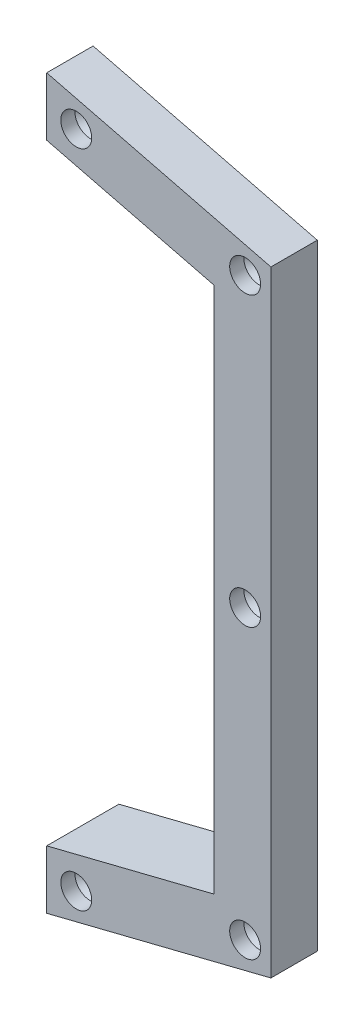
ISO-10303-21;
HEADER;
FILE_DESCRIPTION(('STEP AP214'),'2;1');
FILE_NAME('part.step','',(''),(''),'','','');
FILE_SCHEMA(('AUTOMOTIVE_DESIGN { 1 0 10303 214 1 1 1 1 }'));
ENDSEC;
DATA;
#1=APPLICATION_CONTEXT('core data for automotive mechanical design processes');
#2=APPLICATION_PROTOCOL_DEFINITION('international standard','automotive_design',2000,#1);
#3=PRODUCT_CONTEXT('',#1,'mechanical');
#4=PRODUCT('Part','Part','',(#3));
#5=PRODUCT_RELATED_PRODUCT_CATEGORY('part','',(#4));
#6=PRODUCT_DEFINITION_FORMATION('','',#4);
#7=PRODUCT_DEFINITION_CONTEXT('part definition',#1,'design');
#8=PRODUCT_DEFINITION('design','',#6,#7);
#9=PRODUCT_DEFINITION_SHAPE('','',#8);
#10=(LENGTH_UNIT() NAMED_UNIT(*) SI_UNIT(.MILLI.,.METRE.));
#11=(NAMED_UNIT(*) PLANE_ANGLE_UNIT() SI_UNIT($,.RADIAN.));
#12=(NAMED_UNIT(*) SI_UNIT($,.STERADIAN.) SOLID_ANGLE_UNIT());
#13=UNCERTAINTY_MEASURE_WITH_UNIT(LENGTH_MEASURE(1.E-05),#10,'distance_accuracy_value','');
#14=(GEOMETRIC_REPRESENTATION_CONTEXT(3) GLOBAL_UNCERTAINTY_ASSIGNED_CONTEXT((#13)) GLOBAL_UNIT_ASSIGNED_CONTEXT((#10,
#11,#12)) REPRESENTATION_CONTEXT('',''));
#15=CARTESIAN_POINT('',(0.,0.,0.));
#16=DIRECTION('',(0.,0.,1.));
#17=DIRECTION('',(1.,0.,0.));
#18=AXIS2_PLACEMENT_3D('',#15,#16,#17);
#19=CARTESIAN_POINT('',(35.8540171919359,215.661961497236,752.225073242188));
#20=DIRECTION('',(0.,0.,1.));
#21=DIRECTION('',(1.,0.,0.));
#22=AXIS2_PLACEMENT_3D('',#19,#20,#21);
#23=CONICAL_SURFACE('',#22,2.375,0.785398163397448);
#24=CARTESIAN_POINT('',(35.8540171919359,215.661961497236,751.600073242188));
#25=DIRECTION('',(0.,0.,-1.));
#26=DIRECTION('',(1.,0.,0.));
#27=AXIS2_PLACEMENT_3D('',#24,#25,#26);
#28=CIRCLE('',#27,1.75);
#29=CARTESIAN_POINT('',(37.6040171919359,215.661961497236,751.600073242188));
#30=VERTEX_POINT('',#29);
#31=EDGE_CURVE('E10',#30,#30,#28,.T.);
#32=ORIENTED_EDGE('',*,*,#31,.T.);
#33=EDGE_LOOP('',(#32));
#34=FACE_BOUND('',#33,.T.);
#35=CARTESIAN_POINT('',(35.8540171919359,215.661961497236,752.850073242188));
#36=DIRECTION('',(0.,0.,1.));
#37=DIRECTION('',(1.,0.,0.));
#38=AXIS2_PLACEMENT_3D('',#35,#36,#37);
#39=CIRCLE('',#38,3.);
#40=CARTESIAN_POINT('',(38.8540171919359,215.661961497236,752.850073242188));
#41=VERTEX_POINT('',#40);
#42=EDGE_CURVE('E25',#41,#41,#39,.T.);
#43=ORIENTED_EDGE('',*,*,#42,.T.);
#44=EDGE_LOOP('',(#43));
#45=FACE_BOUND('',#44,.T.);
#46=ADVANCED_FACE('F15',(#34,#45),#23,.F.);
#47=CARTESIAN_POINT('',(35.8540171919359,215.661961497236,751.600073242188));
#48=DIRECTION('',(0.,0.,-1.));
#49=DIRECTION('',(-1.,0.,0.));
#50=AXIS2_PLACEMENT_3D('',#47,#48,#49);
#51=PLANE('',#50);
#52=CARTESIAN_POINT('',(35.8540171919359,215.661961497236,751.600073242188));
#53=DIRECTION('',(0.,0.,-1.));
#54=DIRECTION('',(1.,0.,0.));
#55=AXIS2_PLACEMENT_3D('',#52,#53,#54);
#56=CIRCLE('',#55,1.725);
#57=CARTESIAN_POINT('',(37.5790171919359,215.661961497236,751.600073242188));
#58=VERTEX_POINT('',#57);
#59=EDGE_CURVE('E293',#58,#58,#56,.T.);
#60=ORIENTED_EDGE('',*,*,#59,.T.);
#61=EDGE_LOOP('',(#60));
#62=FACE_BOUND('',#61,.T.);
#63=ORIENTED_EDGE('',*,*,#31,.F.);
#64=EDGE_LOOP('',(#63));
#65=FACE_BOUND('',#64,.T.);
#66=ADVANCED_FACE('F309',(#62,#65),#51,.F.);
#67=CARTESIAN_POINT('',(35.8540171919359,215.661961497236,765.599960327148));
#68=DIRECTION('',(0.,0.,1.));
#69=DIRECTION('',(1.,0.,0.));
#70=AXIS2_PLACEMENT_3D('',#67,#68,#69);
#71=CYLINDRICAL_SURFACE('',#70,3.);
#72=CARTESIAN_POINT('',(35.8540171919359,215.661961497236,755.600103759766));
#73=DIRECTION('',(0.,0.,-1.));
#74=DIRECTION('',(1.,0.,0.));
#75=AXIS2_PLACEMENT_3D('',#72,#73,#74);
#76=CIRCLE('',#75,3.);
#77=CARTESIAN_POINT('',(38.8540171919359,215.661961497236,755.600103759766));
#78=VERTEX_POINT('',#77);
#79=EDGE_CURVE('E193',#78,#78,#76,.T.);
#80=ORIENTED_EDGE('',*,*,#79,.F.);
#81=EDGE_LOOP('',(#80));
#82=FACE_BOUND('',#81,.T.);
#83=ORIENTED_EDGE('',*,*,#42,.F.);
#84=EDGE_LOOP('',(#83));
#85=FACE_BOUND('',#84,.T.);
#86=ADVANCED_FACE('F306',(#82,#85),#71,.F.);
#87=CARTESIAN_POINT('',(35.8540171919359,215.661961497236,749.599960327148));
#88=DIRECTION('',(0.,0.,-1.));
#89=DIRECTION('',(1.,0.,0.));
#90=AXIS2_PLACEMENT_3D('',#87,#88,#89);
#91=CYLINDRICAL_SURFACE('',#90,1.725);
#92=CARTESIAN_POINT('',(35.8540171919359,215.661961497236,746.599960327148));
#93=DIRECTION('',(0.,0.,1.));
#94=DIRECTION('',(1.,0.,0.));
#95=AXIS2_PLACEMENT_3D('',#92,#93,#94);
#96=CIRCLE('',#95,1.725);
#97=CARTESIAN_POINT('',(37.5790171919359,215.661961497236,746.599960327148));
#98=VERTEX_POINT('',#97);
#99=EDGE_CURVE('E159',#98,#98,#96,.T.);
#100=ORIENTED_EDGE('',*,*,#99,.F.);
#101=EDGE_LOOP('',(#100));
#102=FACE_BOUND('',#101,.T.);
#103=ORIENTED_EDGE('',*,*,#59,.F.);
#104=EDGE_LOOP('',(#103));
#105=FACE_BOUND('',#104,.T.);
#106=ADVANCED_FACE('F308',(#102,#105),#91,.F.);
#107=CARTESIAN_POINT('',(68.6260171919359,223.854961497236,753.100036621094));
#108=DIRECTION('',(0.,0.,1.));
#109=DIRECTION('',(1.,0.,0.));
#110=AXIS2_PLACEMENT_3D('',#107,#108,#109);
#111=CYLINDRICAL_SURFACE('',#110,3.);
#112=CARTESIAN_POINT('',(68.6260171919359,223.854961497236,755.600103759766));
#113=DIRECTION('',(0.,0.,-1.));
#114=DIRECTION('',(1.,0.,0.));
#115=AXIS2_PLACEMENT_3D('',#112,#113,#114);
#116=CIRCLE('',#115,3.);
#117=CARTESIAN_POINT('',(71.6260171919359,223.854961497236,755.600103759766));
#118=VERTEX_POINT('',#117);
#119=EDGE_CURVE('E189',#118,#118,#116,.T.);
#120=ORIENTED_EDGE('',*,*,#119,.F.);
#121=EDGE_LOOP('',(#120));
#122=FACE_BOUND('',#121,.T.);
#123=CARTESIAN_POINT('',(68.6260171919359,223.854961497236,752.850036621094));
#124=DIRECTION('',(0.,0.,1.));
#125=DIRECTION('',(-1.,0.,0.));
#126=AXIS2_PLACEMENT_3D('',#123,#124,#125);
#127=CIRCLE('',#126,3.);
#128=CARTESIAN_POINT('',(65.6260171919359,223.854961497236,752.850036621094));
#129=VERTEX_POINT('',#128);
#130=EDGE_CURVE('E288',#129,#129,#127,.T.);
#131=ORIENTED_EDGE('',*,*,#130,.F.);
#132=EDGE_LOOP('',(#131));
#133=FACE_BOUND('',#132,.T.);
#134=ADVANCED_FACE('F317',(#122,#133),#111,.F.);
#135=CARTESIAN_POINT('',(68.6260171919359,223.854961497236,752.225036621094));
#136=DIRECTION('',(0.,0.,1.));
#137=DIRECTION('',(-1.,0.,0.));
#138=AXIS2_PLACEMENT_3D('',#135,#136,#137);
#139=CONICAL_SURFACE('',#138,2.375,0.785398163397448);
#140=CARTESIAN_POINT('',(68.6260171919359,223.854961497236,751.600036621094));
#141=DIRECTION('',(0.,0.,-1.));
#142=DIRECTION('',(-1.,0.,0.));
#143=AXIS2_PLACEMENT_3D('',#140,#141,#142);
#144=CIRCLE('',#143,1.75);
#145=CARTESIAN_POINT('',(66.8760171919359,223.854961497236,751.600036621094));
#146=VERTEX_POINT('',#145);
#147=EDGE_CURVE('E290',#146,#146,#144,.T.);
#148=ORIENTED_EDGE('',*,*,#147,.T.);
#149=EDGE_LOOP('',(#148));
#150=FACE_BOUND('',#149,.T.);
#151=ORIENTED_EDGE('',*,*,#130,.T.);
#152=EDGE_LOOP('',(#151));
#153=FACE_BOUND('',#152,.T.);
#154=ADVANCED_FACE('F358',(#150,#153),#139,.F.);
#155=CARTESIAN_POINT('',(68.6260171919359,223.854961497236,751.600036621094));
#156=DIRECTION('',(0.,0.,-1.));
#157=DIRECTION('',(-1.,0.,0.));
#158=AXIS2_PLACEMENT_3D('',#155,#156,#157);
#159=PLANE('',#158);
#160=CARTESIAN_POINT('',(68.6260171919359,223.854961497236,751.600036621094));
#161=DIRECTION('',(0.,0.,1.));
#162=DIRECTION('',(1.,0.,0.));
#163=AXIS2_PLACEMENT_3D('',#160,#161,#162);
#164=CIRCLE('',#163,1.725);
#165=CARTESIAN_POINT('',(70.3510171919359,223.854961497236,751.600036621094));
#166=VERTEX_POINT('',#165);
#167=EDGE_CURVE('E172',#166,#166,#164,.T.);
#168=ORIENTED_EDGE('',*,*,#167,.F.);
#169=EDGE_LOOP('',(#168));
#170=FACE_BOUND('',#169,.T.);
#171=ORIENTED_EDGE('',*,*,#147,.F.);
#172=EDGE_LOOP('',(#171));
#173=FACE_BOUND('',#172,.T.);
#174=ADVANCED_FACE('F368',(#170,#173),#159,.F.);
#175=CARTESIAN_POINT('',(44.6398185644058,224.043097191517,752.10007019043));
#176=DIRECTION('',(0.242599230795407,-0.970126596490106,0.));
#177=DIRECTION('',(0.,0.,1.));
#178=AXIS2_PLACEMENT_3D('',#175,#176,#177);
#179=PLANE('',#178);
#180=DIRECTION('',(-0.970126596490106,-0.242599230795407,0.));
#181=VECTOR('',#180,1.);
#182=CARTESIAN_POINT('',(54.559629872372,226.523741059703,741.600103759766));
#183=LINE('',#182,#181);
#184=CARTESIAN_POINT('',(62.6260171919359,228.540899816204,741.600103759766));
#185=VERTEX_POINT('',#184);
#186=CARTESIAN_POINT('',(30.1240168600573,220.413135554969,741.600103759766));
#187=VERTEX_POINT('',#186);
#188=EDGE_CURVE('E287',#185,#187,#183,.T.);
#189=ORIENTED_EDGE('',*,*,#188,.T.);
#190=DIRECTION('',(0.,0.,1.));
#191=VECTOR('',#190,1.);
#192=CARTESIAN_POINT('',(30.1240168600573,220.413135554969,747.019448852539));
#193=LINE('',#192,#191);
#194=CARTESIAN_POINT('',(30.1240168600573,220.413135554969,755.600103759766));
#195=VERTEX_POINT('',#194);
#196=EDGE_CURVE('E34',#187,#195,#193,.T.);
#197=ORIENTED_EDGE('',*,*,#196,.T.);
#198=DIRECTION('',(0.970126596490106,0.242599230795407,0.));
#199=VECTOR('',#198,1.);
#200=CARTESIAN_POINT('',(28.406528511819,219.983643822972,755.600103759766));
#201=LINE('',#200,#199);
#202=CARTESIAN_POINT('',(62.6260171919359,228.540899816204,755.600103759766));
#203=VERTEX_POINT('',#202);
#204=EDGE_CURVE('E283',#195,#203,#201,.T.);
#205=ORIENTED_EDGE('',*,*,#204,.T.);
#206=DIRECTION('',(0.,0.,-1.));
#207=VECTOR('',#206,1.);
#208=CARTESIAN_POINT('',(62.6260171919359,228.540899816204,752.100051752027));
#209=LINE('',#208,#207);
#210=EDGE_CURVE('E280',#203,#185,#209,.T.);
#211=ORIENTED_EDGE('',*,*,#210,.T.);
#212=EDGE_LOOP('',(#189,#197,#205,#211));
#213=FACE_BOUND('',#212,.T.);
#214=ADVANCED_FACE('F378',(#213),#179,.F.);
#215=CARTESIAN_POINT('',(30.1240168600573,308.586961497236,741.938827514648));
#216=DIRECTION('',(-1.,0.,0.));
#217=DIRECTION('',(0.,0.,1.));
#218=AXIS2_PLACEMENT_3D('',#215,#216,#217);
#219=PLANE('',#218);
#220=DIRECTION('',(0.,-1.,0.));
#221=VECTOR('',#220,1.);
#222=CARTESIAN_POINT('',(30.1240168600573,282.242390681196,746.599960327148));
#223=LINE('',#222,#221);
#224=CARTESIAN_POINT('',(30.1240168600573,218.351548946339,746.599960327148));
#225=VERTEX_POINT('',#224);
#226=CARTESIAN_POINT('',(30.1240168600573,209.074409207503,746.599960327148));
#227=VERTEX_POINT('',#226);
#228=EDGE_CURVE('E265',#225,#227,#223,.T.);
#229=ORIENTED_EDGE('',*,*,#228,.T.);
#230=DIRECTION('',(0.,0.,-1.));
#231=VECTOR('',#230,1.);
#232=CARTESIAN_POINT('',(30.1240168600573,209.074409207503,735.269432067871));
#233=LINE('',#232,#231);
#234=CARTESIAN_POINT('',(30.1240168600573,209.074409207503,755.600103759766));
#235=VERTEX_POINT('',#234);
#236=EDGE_CURVE('E272',#235,#227,#233,.T.);
#237=ORIENTED_EDGE('',*,*,#236,.F.);
#238=DIRECTION('',(0.,1.,0.));
#239=VECTOR('',#238,1.);
#240=CARTESIAN_POINT('',(30.1240168600573,259.345196186362,755.600103759766));
#241=LINE('',#240,#239);
#242=EDGE_CURVE('E262',#235,#195,#241,.T.);
#243=ORIENTED_EDGE('',*,*,#242,.T.);
#244=ORIENTED_EDGE('',*,*,#196,.F.);
#245=DIRECTION('',(0.,-1.,0.));
#246=VECTOR('',#245,1.);
#247=CARTESIAN_POINT('',(30.1240168600573,283.641711497236,741.600103759766));
#248=LINE('',#247,#246);
#249=CARTESIAN_POINT('',(30.1240168600573,218.351548946339,741.600103759766));
#250=VERTEX_POINT('',#249);
#251=EDGE_CURVE('E254',#187,#250,#248,.T.);
#252=ORIENTED_EDGE('',*,*,#251,.T.);
#253=DIRECTION('',(0.,0.,-1.));
#254=VECTOR('',#253,1.);
#255=CARTESIAN_POINT('',(30.1240168600573,218.351548946339,747.019448852539));
#256=LINE('',#255,#254);
#257=EDGE_CURVE('E173',#225,#250,#256,.T.);
#258=ORIENTED_EDGE('',*,*,#257,.F.);
#259=EDGE_LOOP('',(#229,#237,#243,#244,#252,#258));
#260=FACE_BOUND('',#259,.T.);
#261=ADVANCED_FACE('F261',(#260),#219,.T.);
#262=CARTESIAN_POINT('',(14.8418299979816,205.252797893037,728.600036621094));
#263=DIRECTION('',(-0.242599230795407,0.970126596490106,0.));
#264=DIRECTION('',(0.,0.,1.));
#265=AXIS2_PLACEMENT_3D('',#262,#263,#264);
#266=PLANE('',#265);
#267=DIRECTION('',(0.970126596490106,0.242599230795407,0.));
#268=VECTOR('',#267,1.);
#269=CARTESIAN_POINT('',(46.2347395502587,213.103212197073,746.599960327148));
#270=LINE('',#269,#268);
#271=CARTESIAN_POINT('',(73.6260162382616,219.952939520348,746.599960327148));
#272=VERTEX_POINT('',#271);
#273=EDGE_CURVE('E263',#227,#272,#270,.T.);
#274=ORIENTED_EDGE('',*,*,#273,.T.);
#275=DIRECTION('',(0.,0.,1.));
#276=VECTOR('',#275,1.);
#277=CARTESIAN_POINT('',(73.6260162382616,219.952939520348,739.059997558594));
#278=LINE('',#277,#276);
#279=CARTESIAN_POINT('',(73.6260162382616,219.952939520348,755.600103759766));
#280=VERTEX_POINT('',#279);
#281=EDGE_CURVE('E268',#272,#280,#278,.T.);
#282=ORIENTED_EDGE('',*,*,#281,.T.);
#283=DIRECTION('',(0.970126596490106,0.242599230795407,0.));
#284=VECTOR('',#283,1.);
#285=CARTESIAN_POINT('',(14.8418299979816,205.252797893037,755.600103759766));
#286=LINE('',#285,#284);
#287=EDGE_CURVE('E167',#235,#280,#286,.T.);
#288=ORIENTED_EDGE('',*,*,#287,.F.);
#289=ORIENTED_EDGE('',*,*,#236,.T.);
#290=EDGE_LOOP('',(#274,#282,#288,#289));
#291=FACE_BOUND('',#290,.T.);
#292=ADVANCED_FACE('F397',(#291),#266,.F.);
#293=CARTESIAN_POINT('',(68.6260171919359,223.854961497236,741.600036621094));
#294=DIRECTION('',(0.,0.,1.));
#295=DIRECTION('',(1.,0.,0.));
#296=AXIS2_PLACEMENT_3D('',#293,#294,#295);
#297=CYLINDRICAL_SURFACE('',#296,1.725);
#298=CARTESIAN_POINT('',(68.6260171919359,223.854961497236,746.599960327148));
#299=DIRECTION('',(0.,0.,1.));
#300=DIRECTION('',(1.,0.,0.));
#301=AXIS2_PLACEMENT_3D('',#298,#299,#300);
#302=CIRCLE('',#301,1.725);
#303=CARTESIAN_POINT('',(70.3510171919359,223.854961497236,746.599960327148));
#304=VERTEX_POINT('',#303);
#305=EDGE_CURVE('E154',#304,#304,#302,.T.);
#306=ORIENTED_EDGE('',*,*,#305,.F.);
#307=EDGE_LOOP('',(#306));
#308=FACE_BOUND('',#307,.T.);
#309=ORIENTED_EDGE('',*,*,#167,.T.);
#310=EDGE_LOOP('',(#309));
#311=FACE_BOUND('',#310,.T.);
#312=ADVANCED_FACE('F406',(#308,#311),#297,.F.);
#313=CARTESIAN_POINT('',(45.1250170259966,222.102843998536,752.10007019043));
#314=DIRECTION('',(-0.242599230795407,0.970126596490106,0.));
#315=DIRECTION('',(0.,0.,-1.));
#316=AXIS2_PLACEMENT_3D('',#313,#314,#315);
#317=PLANE('',#316);
#318=DIRECTION('',(-0.970126596490106,-0.242599230795407,0.));
#319=VECTOR('',#318,1.);
#320=CARTESIAN_POINT('',(44.0513464731,221.834351565484,746.599960327148));
#321=LINE('',#320,#319);
#322=CARTESIAN_POINT('',(64.6260171919359,226.979452533046,746.599960327148));
#323=VERTEX_POINT('',#322);
#324=EDGE_CURVE('E169',#323,#225,#321,.T.);
#325=ORIENTED_EDGE('',*,*,#324,.T.);
#326=ORIENTED_EDGE('',*,*,#257,.T.);
#327=DIRECTION('',(0.970126596490106,0.242599230795407,0.));
#328=VECTOR('',#327,1.);
#329=CARTESIAN_POINT('',(55.0448283339628,224.583487866723,741.600103759766));
#330=LINE('',#329,#328);
#331=CARTESIAN_POINT('',(64.6260171919359,226.979452533046,741.600103759766));
#332=VERTEX_POINT('',#331);
#333=EDGE_CURVE('E174',#250,#332,#330,.T.);
#334=ORIENTED_EDGE('',*,*,#333,.T.);
#335=DIRECTION('',(0.,0.,1.));
#336=VECTOR('',#335,1.);
#337=CARTESIAN_POINT('',(64.6260171919359,226.979452533046,750.600076547559));
#338=LINE('',#337,#336);
#339=EDGE_CURVE('E177',#332,#323,#338,.T.);
#340=ORIENTED_EDGE('',*,*,#339,.T.);
#341=EDGE_LOOP('',(#325,#326,#334,#340));
#342=FACE_BOUND('',#341,.T.);
#343=ADVANCED_FACE('F256',(#342),#317,.F.);
#344=CARTESIAN_POINT('',(62.6260171919359,300.696461501325,752.100033313624));
#345=DIRECTION('',(1.,0.,0.));
#346=DIRECTION('',(0.,0.,-1.));
#347=AXIS2_PLACEMENT_3D('',#344,#345,#346);
#348=PLANE('',#347);
#349=DIRECTION('',(0.,1.,0.));
#350=VECTOR('',#349,1.);
#351=CARTESIAN_POINT('',(62.6260171919359,276.399946188406,755.600103759766));
#352=LINE('',#351,#350);
#353=CARTESIAN_POINT('',(62.6260171919359,330.852023178269,755.600103759766));
#354=VERTEX_POINT('',#353);
#355=EDGE_CURVE('E179',#203,#354,#352,.T.);
#356=ORIENTED_EDGE('',*,*,#355,.T.);
#357=DIRECTION('',(0.,0.,1.));
#358=VECTOR('',#357,1.);
#359=CARTESIAN_POINT('',(62.6260171919359,330.852023178269,752.475046411451));
#360=LINE('',#359,#358);
#361=CARTESIAN_POINT('',(62.6260171919359,330.852023178269,741.600103759766));
#362=VERTEX_POINT('',#361);
#363=EDGE_CURVE('E183',#362,#354,#360,.T.);
#364=ORIENTED_EDGE('',*,*,#363,.F.);
#365=DIRECTION('',(0.,-1.,0.));
#366=VECTOR('',#365,1.);
#367=CARTESIAN_POINT('',(62.6260171919359,258.696461499281,741.600103759766));
#368=LINE('',#367,#366);
#369=EDGE_CURVE('E182',#362,#185,#368,.T.);
#370=ORIENTED_EDGE('',*,*,#369,.T.);
#371=ORIENTED_EDGE('',*,*,#210,.F.);
#372=EDGE_LOOP('',(#356,#364,#370,#371));
#373=FACE_BOUND('',#372,.T.);
#374=ADVANCED_FACE('F424',(#373),#348,.F.);
#375=CARTESIAN_POINT('',(13.6288338440046,252.103430875487,755.600103759766));
#376=DIRECTION('',(0.,0.,-1.));
#377=DIRECTION('',(0.970126596490106,0.242599230795406,0.));
#378=AXIS2_PLACEMENT_3D('',#375,#376,#377);
#379=PLANE('',#378);
#380=ORIENTED_EDGE('',*,*,#119,.T.);
#381=EDGE_LOOP('',(#380));
#382=FACE_BOUND('',#381,.T.);
#383=ORIENTED_EDGE('',*,*,#79,.T.);
#384=EDGE_LOOP('',(#383));
#385=FACE_BOUND('',#384,.T.);
#386=CARTESIAN_POINT('',(68.6260171919359,335.538961497236,755.600103759766));
#387=DIRECTION('',(0.,0.,-1.));
#388=DIRECTION('',(1.,0.,0.));
#389=AXIS2_PLACEMENT_3D('',#386,#387,#388);
#390=CIRCLE('',#389,3.);
#391=CARTESIAN_POINT('',(71.6260171919359,335.538961497236,755.600103759766));
#392=VERTEX_POINT('',#391);
#393=EDGE_CURVE('E190',#392,#392,#390,.T.);
#394=ORIENTED_EDGE('',*,*,#393,.T.);
#395=EDGE_LOOP('',(#394));
#396=FACE_BOUND('',#395,.T.);
#397=CARTESIAN_POINT('',(35.8540171919359,343.732961497236,755.600103759766));
#398=DIRECTION('',(0.,0.,-1.));
#399=DIRECTION('',(1.,0.,0.));
#400=AXIS2_PLACEMENT_3D('',#397,#398,#399);
#401=CIRCLE('',#400,3.);
#402=CARTESIAN_POINT('',(38.8540171919359,343.732961497236,755.600103759766));
#403=VERTEX_POINT('',#402);
#404=EDGE_CURVE('E194',#403,#403,#401,.T.);
#405=ORIENTED_EDGE('',*,*,#404,.T.);
#406=EDGE_LOOP('',(#405));
#407=FACE_BOUND('',#406,.T.);
#408=DIRECTION('',(0.,1.,0.));
#409=VECTOR('',#408,1.);
#410=CARTESIAN_POINT('',(73.6260162382616,290.833545444785,755.600103759766));
#411=LINE('',#410,#409);
#412=CARTESIAN_POINT('',(73.6260162382616,339.439983474125,755.600103759766));
#413=VERTEX_POINT('',#412);
#414=EDGE_CURVE('E197',#280,#413,#411,.T.);
#415=ORIENTED_EDGE('',*,*,#414,.T.);
#416=DIRECTION('',(-0.970126596490106,0.242599230795407,0.));
#417=VECTOR('',#416,1.);
#418=CARTESIAN_POINT('',(26.2782952927255,351.280212082289,755.600103759766));
#419=LINE('',#418,#417);
#420=CARTESIAN_POINT('',(30.1240168600573,350.31851378697,755.600103759766));
#421=VERTEX_POINT('',#420);
#422=EDGE_CURVE('E200',#413,#421,#419,.T.);
#423=ORIENTED_EDGE('',*,*,#422,.T.);
#424=DIRECTION('',(0.,1.,0.));
#425=VECTOR('',#424,1.);
#426=CARTESIAN_POINT('',(30.1240168600573,301.345196186362,755.600103759766));
#427=LINE('',#426,#425);
#428=CARTESIAN_POINT('',(30.1240168600573,338.979787439504,755.600103759766));
#429=VERTEX_POINT('',#428);
#430=EDGE_CURVE('E115',#429,#421,#427,.T.);
#431=ORIENTED_EDGE('',*,*,#430,.F.);
#432=DIRECTION('',(-0.970126596490106,0.242599230795407,0.));
#433=VECTOR('',#432,1.);
#434=CARTESIAN_POINT('',(39.8429938065628,336.549366152353,755.600103759766));
#435=LINE('',#434,#433);
#436=EDGE_CURVE('E186',#354,#429,#435,.T.);
#437=ORIENTED_EDGE('',*,*,#436,.F.);
#438=ORIENTED_EDGE('',*,*,#355,.F.);
#439=ORIENTED_EDGE('',*,*,#204,.F.);
#440=ORIENTED_EDGE('',*,*,#242,.F.);
#441=ORIENTED_EDGE('',*,*,#287,.T.);
#442=EDGE_LOOP('',(#415,#423,#431,#437,#438,#439,#440,#441));
#443=FACE_BOUND('',#442,.T.);
#444=CARTESIAN_POINT('',(68.6260171919359,279.696961497236,755.600103759766));
#445=DIRECTION('',(0.,0.,-1.));
#446=DIRECTION('',(1.,0.,0.));
#447=AXIS2_PLACEMENT_3D('',#444,#445,#446);
#448=CIRCLE('',#447,3.);
#449=CARTESIAN_POINT('',(71.6260171919359,279.696961497236,755.600103759766));
#450=VERTEX_POINT('',#449);
#451=EDGE_CURVE('E203',#450,#450,#448,.T.);
#452=ORIENTED_EDGE('',*,*,#451,.T.);
#453=EDGE_LOOP('',(#452));
#454=FACE_BOUND('',#453,.T.);
#455=ADVANCED_FACE('F433',(#382,#385,#396,#407,#443,#454),#379,.F.);
#456=CARTESIAN_POINT('',(73.6260162382616,329.563660014082,749.519958496094));
#457=DIRECTION('',(1.,0.,0.));
#458=DIRECTION('',(0.,0.,-1.));
#459=AXIS2_PLACEMENT_3D('',#456,#457,#458);
#460=PLANE('',#459);
#461=DIRECTION('',(0.,1.,0.));
#462=VECTOR('',#461,1.);
#463=CARTESIAN_POINT('',(73.6260162382616,313.730739939619,746.599960327148));
#464=LINE('',#463,#462);
#465=CARTESIAN_POINT('',(73.6260162382616,339.439983474125,746.599960327148));
#466=VERTEX_POINT('',#465);
#467=EDGE_CURVE('E206',#272,#466,#464,.T.);
#468=ORIENTED_EDGE('',*,*,#467,.T.);
#469=DIRECTION('',(0.,0.,-1.));
#470=VECTOR('',#469,1.);
#471=CARTESIAN_POINT('',(73.6260162382616,339.439983474125,739.059997558594));
#472=LINE('',#471,#470);
#473=EDGE_CURVE('E120',#413,#466,#472,.T.);
#474=ORIENTED_EDGE('',*,*,#473,.F.);
#475=ORIENTED_EDGE('',*,*,#414,.F.);
#476=ORIENTED_EDGE('',*,*,#281,.F.);
#477=EDGE_LOOP('',(#468,#474,#475,#476));
#478=FACE_BOUND('',#477,.T.);
#479=ADVANCED_FACE('F443',(#478),#460,.T.);
#480=CARTESIAN_POINT('',(68.6260171919359,279.696961497236,753.100036621094));
#481=DIRECTION('',(0.,0.,-1.));
#482=DIRECTION('',(1.,0.,0.));
#483=AXIS2_PLACEMENT_3D('',#480,#481,#482);
#484=CYLINDRICAL_SURFACE('',#483,3.);
#485=ORIENTED_EDGE('',*,*,#451,.F.);
#486=EDGE_LOOP('',(#485));
#487=FACE_BOUND('',#486,.T.);
#488=CARTESIAN_POINT('',(68.6260171919359,279.696961497236,752.850036621094));
#489=DIRECTION('',(0.,0.,1.));
#490=DIRECTION('',(-1.,0.,0.));
#491=AXIS2_PLACEMENT_3D('',#488,#489,#490);
#492=CIRCLE('',#491,3.);
#493=CARTESIAN_POINT('',(65.6260171919359,279.696961497236,752.850036621094));
#494=VERTEX_POINT('',#493);
#495=EDGE_CURVE('E210',#494,#494,#492,.T.);
#496=ORIENTED_EDGE('',*,*,#495,.F.);
#497=EDGE_LOOP('',(#496));
#498=FACE_BOUND('',#497,.T.);
#499=ADVANCED_FACE('F453',(#487,#498),#484,.F.);
#500=CARTESIAN_POINT('',(68.6260171919359,279.696961497236,752.225036621094));
#501=DIRECTION('',(0.,0.,1.));
#502=DIRECTION('',(-1.,0.,0.));
#503=AXIS2_PLACEMENT_3D('',#500,#501,#502);
#504=CONICAL_SURFACE('',#503,2.375,0.785398163397448);
#505=CARTESIAN_POINT('',(68.6260171919359,279.696961497236,751.600036621094));
#506=DIRECTION('',(0.,0.,-1.));
#507=DIRECTION('',(-1.,0.,0.));
#508=AXIS2_PLACEMENT_3D('',#505,#506,#507);
#509=CIRCLE('',#508,1.75);
#510=CARTESIAN_POINT('',(66.8760171919359,279.696961497236,751.600036621094));
#511=VERTEX_POINT('',#510);
#512=EDGE_CURVE('E208',#511,#511,#509,.T.);
#513=ORIENTED_EDGE('',*,*,#512,.T.);
#514=EDGE_LOOP('',(#513));
#515=FACE_BOUND('',#514,.T.);
#516=ORIENTED_EDGE('',*,*,#495,.T.);
#517=EDGE_LOOP('',(#516));
#518=FACE_BOUND('',#517,.T.);
#519=ADVANCED_FACE('F463',(#515,#518),#504,.F.);
#520=CARTESIAN_POINT('',(68.6260171919359,279.696961497236,751.600036621094));
#521=DIRECTION('',(0.,0.,-1.));
#522=DIRECTION('',(1.,0.,0.));
#523=AXIS2_PLACEMENT_3D('',#520,#521,#522);
#524=PLANE('',#523);
#525=CARTESIAN_POINT('',(68.6260171919359,279.696961497236,751.600036621094));
#526=DIRECTION('',(0.,0.,1.));
#527=DIRECTION('',(1.,0.,0.));
#528=AXIS2_PLACEMENT_3D('',#525,#526,#527);
#529=CIRCLE('',#528,1.725);
#530=CARTESIAN_POINT('',(70.3510171919359,279.696961497236,751.600036621094));
#531=VERTEX_POINT('',#530);
#532=EDGE_CURVE('E213',#531,#531,#529,.T.);
#533=ORIENTED_EDGE('',*,*,#532,.F.);
#534=EDGE_LOOP('',(#533));
#535=FACE_BOUND('',#534,.T.);
#536=ORIENTED_EDGE('',*,*,#512,.F.);
#537=EDGE_LOOP('',(#536));
#538=FACE_BOUND('',#537,.T.);
#539=ADVANCED_FACE('F473',(#535,#538),#524,.F.);
#540=CARTESIAN_POINT('',(68.6260171919359,279.696961497236,741.600036621094));
#541=DIRECTION('',(0.,0.,1.));
#542=DIRECTION('',(1.,0.,0.));
#543=AXIS2_PLACEMENT_3D('',#540,#541,#542);
#544=CYLINDRICAL_SURFACE('',#543,1.725);
#545=CARTESIAN_POINT('',(68.6260171919359,279.696961497236,746.599960327148));
#546=DIRECTION('',(0.,0.,1.));
#547=DIRECTION('',(1.,0.,0.));
#548=AXIS2_PLACEMENT_3D('',#545,#546,#547);
#549=CIRCLE('',#548,1.725);
#550=CARTESIAN_POINT('',(70.3510171919359,279.696961497236,746.599960327148));
#551=VERTEX_POINT('',#550);
#552=EDGE_CURVE('E149',#551,#551,#549,.T.);
#553=ORIENTED_EDGE('',*,*,#552,.F.);
#554=EDGE_LOOP('',(#553));
#555=FACE_BOUND('',#554,.T.);
#556=ORIENTED_EDGE('',*,*,#532,.T.);
#557=EDGE_LOOP('',(#556));
#558=FACE_BOUND('',#557,.T.);
#559=ADVANCED_FACE('F483',(#555,#558),#544,.F.);
#560=CARTESIAN_POINT('',(64.6260171919359,270.696461501325,749.100082904689));
#561=DIRECTION('',(-1.,0.,0.));
#562=DIRECTION('',(0.,0.,1.));
#563=AXIS2_PLACEMENT_3D('',#560,#561,#562);
#564=PLANE('',#563);
#565=DIRECTION('',(0.,1.,0.));
#566=VECTOR('',#565,1.);
#567=CARTESIAN_POINT('',(64.6260171919359,285.696461499281,741.600103759766));
#568=LINE('',#567,#566);
#569=CARTESIAN_POINT('',(64.6260171919359,332.413470461427,741.600103759766));
#570=VERTEX_POINT('',#569);
#571=EDGE_CURVE('E218',#332,#570,#568,.T.);
#572=ORIENTED_EDGE('',*,*,#571,.T.);
#573=DIRECTION('',(0.,0.,-1.));
#574=VECTOR('',#573,1.);
#575=CARTESIAN_POINT('',(64.6260171919359,332.413470461427,750.975071206983));
#576=LINE('',#575,#574);
#577=CARTESIAN_POINT('',(64.6260171919359,332.413470461427,746.599960327148));
#578=VERTEX_POINT('',#577);
#579=EDGE_CURVE('E224',#578,#570,#576,.T.);
#580=ORIENTED_EDGE('',*,*,#579,.F.);
#581=DIRECTION('',(0.,-1.,0.));
#582=VECTOR('',#581,1.);
#583=CARTESIAN_POINT('',(64.6260171919359,316.718390681196,746.599960327148));
#584=LINE('',#583,#582);
#585=EDGE_CURVE('E223',#578,#323,#584,.T.);
#586=ORIENTED_EDGE('',*,*,#585,.T.);
#587=ORIENTED_EDGE('',*,*,#339,.F.);
#588=EDGE_LOOP('',(#572,#580,#586,#587));
#589=FACE_BOUND('',#588,.T.);
#590=ADVANCED_FACE('F250',(#589),#564,.F.);
#591=CARTESIAN_POINT('',(57.0543536067133,300.696461497236,741.600103759766));
#592=DIRECTION('',(0.,0.,-1.));
#593=DIRECTION('',(1.,0.,0.));
#594=AXIS2_PLACEMENT_3D('',#591,#592,#593);
#595=PLANE('',#594);
#596=ORIENTED_EDGE('',*,*,#369,.F.);
#597=DIRECTION('',(0.970126596490106,-0.242599230795407,0.));
#598=VECTOR('',#597,1.);
#599=CARTESIAN_POINT('',(54.559629872372,332.869181934769,741.600103759766));
#600=LINE('',#599,#598);
#601=CARTESIAN_POINT('',(30.1240168600573,338.979787439504,741.600103759766));
#602=VERTEX_POINT('',#601);
#603=EDGE_CURVE('E185',#602,#362,#600,.T.);
#604=ORIENTED_EDGE('',*,*,#603,.F.);
#605=DIRECTION('',(0.,-1.,0.));
#606=VECTOR('',#605,1.);
#607=CARTESIAN_POINT('',(30.1240168600573,325.641711497236,741.600103759766));
#608=LINE('',#607,#606);
#609=CARTESIAN_POINT('',(30.1240168600573,341.041374048134,741.600103759766));
#610=VERTEX_POINT('',#609);
#611=EDGE_CURVE('E129',#610,#602,#608,.T.);
#612=ORIENTED_EDGE('',*,*,#611,.F.);
#613=DIRECTION('',(-0.970126596490106,0.242599230795407,0.));
#614=VECTOR('',#613,1.);
#615=CARTESIAN_POINT('',(55.0448283339628,334.809435127749,741.600103759766));
#616=LINE('',#615,#614);
#617=EDGE_CURVE('E226',#570,#610,#616,.T.);
#618=ORIENTED_EDGE('',*,*,#617,.F.);
#619=ORIENTED_EDGE('',*,*,#571,.F.);
#620=ORIENTED_EDGE('',*,*,#333,.F.);
#621=ORIENTED_EDGE('',*,*,#251,.F.);
#622=ORIENTED_EDGE('',*,*,#188,.F.);
#623=EDGE_LOOP('',(#596,#604,#612,#618,#619,#620,#621,#622));
#624=FACE_BOUND('',#623,.T.);
#625=ADVANCED_FACE('F246',(#624),#595,.T.);
#626=CARTESIAN_POINT('',(45.1250170259966,337.290078995936,752.850059509278));
#627=DIRECTION('',(-0.242599230795407,-0.970126596490106,0.));
#628=DIRECTION('',(0.,0.,1.));
#629=AXIS2_PLACEMENT_3D('',#626,#627,#628);
#630=PLANE('',#629);
#631=DIRECTION('',(0.970126596490106,-0.242599230795407,0.));
#632=VECTOR('',#631,1.);
#633=CARTESIAN_POINT('',(44.7100122835709,337.393859091908,746.599960327148));
#634=LINE('',#633,#632);
#635=CARTESIAN_POINT('',(30.1240168600573,341.041374048134,746.599960327148));
#636=VERTEX_POINT('',#635);
#637=EDGE_CURVE('E127',#636,#578,#634,.T.);
#638=ORIENTED_EDGE('',*,*,#637,.T.);
#639=ORIENTED_EDGE('',*,*,#579,.T.);
#640=ORIENTED_EDGE('',*,*,#617,.T.);
#641=DIRECTION('',(0.,0.,1.));
#642=VECTOR('',#641,1.);
#643=CARTESIAN_POINT('',(30.1240168600573,341.041374048134,747.394443511963));
#644=LINE('',#643,#642);
#645=EDGE_CURVE('E103',#610,#636,#644,.T.);
#646=ORIENTED_EDGE('',*,*,#645,.T.);
#647=EDGE_LOOP('',(#638,#639,#640,#646));
#648=FACE_BOUND('',#647,.T.);
#649=ADVANCED_FACE('F248',(#648),#630,.F.);
#650=CARTESIAN_POINT('',(68.6260171919359,335.538961497236,741.600036621094));
#651=DIRECTION('',(0.,0.,1.));
#652=DIRECTION('',(1.,0.,0.));
#653=AXIS2_PLACEMENT_3D('',#650,#651,#652);
#654=CYLINDRICAL_SURFACE('',#653,1.725);
#655=CARTESIAN_POINT('',(68.6260171919359,335.538961497236,746.599960327148));
#656=DIRECTION('',(0.,0.,1.));
#657=DIRECTION('',(1.,0.,0.));
#658=AXIS2_PLACEMENT_3D('',#655,#656,#657);
#659=CIRCLE('',#658,1.725);
#660=CARTESIAN_POINT('',(70.3510171919359,335.538961497236,746.599960327148));
#661=VERTEX_POINT('',#660);
#662=EDGE_CURVE('E150',#661,#661,#659,.T.);
#663=ORIENTED_EDGE('',*,*,#662,.F.);
#664=EDGE_LOOP('',(#663));
#665=FACE_BOUND('',#664,.T.);
#666=CARTESIAN_POINT('',(68.6260171919359,335.538961497236,751.600036621094));
#667=DIRECTION('',(0.,0.,1.));
#668=DIRECTION('',(1.,0.,0.));
#669=AXIS2_PLACEMENT_3D('',#666,#667,#668);
#670=CIRCLE('',#669,1.725);
#671=CARTESIAN_POINT('',(70.3510171919359,335.538961497236,751.600036621094));
#672=VERTEX_POINT('',#671);
#673=EDGE_CURVE('E128',#672,#672,#670,.T.);
#674=ORIENTED_EDGE('',*,*,#673,.T.);
#675=EDGE_LOOP('',(#674));
#676=FACE_BOUND('',#675,.T.);
#677=ADVANCED_FACE('F518',(#665,#676),#654,.F.);
#678=CARTESIAN_POINT('',(30.1240168600573,350.586961497236,741.938827514648));
#679=DIRECTION('',(-1.,0.,0.));
#680=DIRECTION('',(0.,0.,1.));
#681=AXIS2_PLACEMENT_3D('',#678,#679,#680);
#682=PLANE('',#681);
#683=DIRECTION('',(0.,-1.,0.));
#684=VECTOR('',#683,1.);
#685=CARTESIAN_POINT('',(30.1240168600573,324.242390681196,746.599960327148));
#686=LINE('',#685,#684);
#687=CARTESIAN_POINT('',(30.1240168600573,350.31851378697,746.599960327148));
#688=VERTEX_POINT('',#687);
#689=EDGE_CURVE('E112',#688,#636,#686,.T.);
#690=ORIENTED_EDGE('',*,*,#689,.T.);
#691=ORIENTED_EDGE('',*,*,#645,.F.);
#692=ORIENTED_EDGE('',*,*,#611,.T.);
#693=DIRECTION('',(0.,0.,-1.));
#694=VECTOR('',#693,1.);
#695=CARTESIAN_POINT('',(30.1240168600573,338.979787439504,747.394443511963));
#696=LINE('',#695,#694);
#697=EDGE_CURVE('E141',#429,#602,#696,.T.);
#698=ORIENTED_EDGE('',*,*,#697,.F.);
#699=ORIENTED_EDGE('',*,*,#430,.T.);
#700=DIRECTION('',(0.,0.,1.));
#701=VECTOR('',#700,1.);
#702=CARTESIAN_POINT('',(30.1240168600573,350.31851378697,735.269432067871));
#703=LINE('',#702,#701);
#704=EDGE_CURVE('E109',#688,#421,#703,.T.);
#705=ORIENTED_EDGE('',*,*,#704,.F.);
#706=EDGE_LOOP('',(#690,#691,#692,#698,#699,#705));
#707=FACE_BOUND('',#706,.T.);
#708=ADVANCED_FACE('F111',(#707),#682,.T.);
#709=CARTESIAN_POINT('',(14.8418299979816,354.140125101436,728.600036621094));
#710=DIRECTION('',(-0.242599230795407,-0.970126596490106,0.));
#711=DIRECTION('',(0.,0.,-1.));
#712=AXIS2_PLACEMENT_3D('',#709,#710,#711);
#713=PLANE('',#712);
#714=DIRECTION('',(-0.970126596490106,0.242599230795407,0.));
#715=VECTOR('',#714,1.);
#716=CARTESIAN_POINT('',(46.8934053607296,346.124998460319,746.599960327148));
#717=LINE('',#716,#715);
#718=EDGE_CURVE('E119',#466,#688,#717,.T.);
#719=ORIENTED_EDGE('',*,*,#718,.T.);
#720=ORIENTED_EDGE('',*,*,#704,.T.);
#721=ORIENTED_EDGE('',*,*,#422,.F.);
#722=ORIENTED_EDGE('',*,*,#473,.T.);
#723=EDGE_LOOP('',(#719,#720,#721,#722));
#724=FACE_BOUND('',#723,.T.);
#725=ADVANCED_FACE('F131',(#724),#713,.F.);
#726=CARTESIAN_POINT('',(44.6398185644058,335.349825802956,752.850059509278));
#727=DIRECTION('',(0.242599230795407,0.970126596490106,0.));
#728=DIRECTION('',(0.,0.,-1.));
#729=AXIS2_PLACEMENT_3D('',#726,#727,#728);
#730=PLANE('',#729);
#731=ORIENTED_EDGE('',*,*,#603,.T.);
#732=ORIENTED_EDGE('',*,*,#363,.T.);
#733=ORIENTED_EDGE('',*,*,#436,.T.);
#734=ORIENTED_EDGE('',*,*,#697,.T.);
#735=EDGE_LOOP('',(#731,#732,#733,#734));
#736=FACE_BOUND('',#735,.T.);
#737=ADVANCED_FACE('F241',(#736),#730,.F.);
#738=CARTESIAN_POINT('',(68.6260171919359,335.538961497236,751.600036621094));
#739=DIRECTION('',(0.,0.,-1.));
#740=DIRECTION('',(-1.,0.,0.));
#741=AXIS2_PLACEMENT_3D('',#738,#739,#740);
#742=PLANE('',#741);
#743=ORIENTED_EDGE('',*,*,#673,.F.);
#744=EDGE_LOOP('',(#743));
#745=FACE_BOUND('',#744,.T.);
#746=CARTESIAN_POINT('',(68.6260171919359,335.538961497236,751.600036621094));
#747=DIRECTION('',(0.,0.,-1.));
#748=DIRECTION('',(-1.,0.,0.));
#749=AXIS2_PLACEMENT_3D('',#746,#747,#748);
#750=CIRCLE('',#749,1.75);
#751=CARTESIAN_POINT('',(66.8760171919359,335.538961497236,751.600036621094));
#752=VERTEX_POINT('',#751);
#753=EDGE_CURVE('E138',#752,#752,#750,.T.);
#754=ORIENTED_EDGE('',*,*,#753,.F.);
#755=EDGE_LOOP('',(#754));
#756=FACE_BOUND('',#755,.T.);
#757=ADVANCED_FACE('F552',(#745,#756),#742,.F.);
#758=CARTESIAN_POINT('',(68.6260171919359,335.538961497236,752.225036621094));
#759=DIRECTION('',(0.,0.,1.));
#760=DIRECTION('',(-1.,0.,0.));
#761=AXIS2_PLACEMENT_3D('',#758,#759,#760);
#762=CONICAL_SURFACE('',#761,2.375,0.785398163397448);
#763=ORIENTED_EDGE('',*,*,#753,.T.);
#764=EDGE_LOOP('',(#763));
#765=FACE_BOUND('',#764,.T.);
#766=CARTESIAN_POINT('',(68.6260171919359,335.538961497236,752.850036621094));
#767=DIRECTION('',(0.,0.,1.));
#768=DIRECTION('',(-1.,0.,0.));
#769=AXIS2_PLACEMENT_3D('',#766,#767,#768);
#770=CIRCLE('',#769,3.);
#771=CARTESIAN_POINT('',(65.6260171919359,335.538961497236,752.850036621094));
#772=VERTEX_POINT('',#771);
#773=EDGE_CURVE('E142',#772,#772,#770,.T.);
#774=ORIENTED_EDGE('',*,*,#773,.T.);
#775=EDGE_LOOP('',(#774));
#776=FACE_BOUND('',#775,.T.);
#777=ADVANCED_FACE('F561',(#765,#776),#762,.F.);
#778=CARTESIAN_POINT('',(68.6260171919359,335.538961497236,753.100036621094));
#779=DIRECTION('',(0.,0.,1.));
#780=DIRECTION('',(1.,0.,0.));
#781=AXIS2_PLACEMENT_3D('',#778,#779,#780);
#782=CYLINDRICAL_SURFACE('',#781,3.);
#783=ORIENTED_EDGE('',*,*,#393,.F.);
#784=EDGE_LOOP('',(#783));
#785=FACE_BOUND('',#784,.T.);
#786=ORIENTED_EDGE('',*,*,#773,.F.);
#787=EDGE_LOOP('',(#786));
#788=FACE_BOUND('',#787,.T.);
#789=ADVANCED_FACE('F571',(#785,#788),#782,.F.);
#790=CARTESIAN_POINT('',(35.8540171919359,343.732961497236,749.599960327148));
#791=DIRECTION('',(0.,0.,-1.));
#792=DIRECTION('',(1.,0.,0.));
#793=AXIS2_PLACEMENT_3D('',#790,#791,#792);
#794=CYLINDRICAL_SURFACE('',#793,1.725);
#795=CARTESIAN_POINT('',(35.8540171919359,343.732961497236,746.599960327148));
#796=DIRECTION('',(0.,0.,1.));
#797=DIRECTION('',(1.,0.,0.));
#798=AXIS2_PLACEMENT_3D('',#795,#796,#797);
#799=CIRCLE('',#798,1.725);
#800=CARTESIAN_POINT('',(37.5790171919359,343.732961497236,746.599960327148));
#801=VERTEX_POINT('',#800);
#802=EDGE_CURVE('E146',#801,#801,#799,.T.);
#803=ORIENTED_EDGE('',*,*,#802,.F.);
#804=EDGE_LOOP('',(#803));
#805=FACE_BOUND('',#804,.T.);
#806=CARTESIAN_POINT('',(35.8540171919359,343.732961497236,751.600073242188));
#807=DIRECTION('',(0.,0.,-1.));
#808=DIRECTION('',(1.,0.,0.));
#809=AXIS2_PLACEMENT_3D('',#806,#807,#808);
#810=CIRCLE('',#809,1.725);
#811=CARTESIAN_POINT('',(37.5790171919359,343.732961497236,751.600073242188));
#812=VERTEX_POINT('',#811);
#813=EDGE_CURVE('E145',#812,#812,#810,.T.);
#814=ORIENTED_EDGE('',*,*,#813,.F.);
#815=EDGE_LOOP('',(#814));
#816=FACE_BOUND('',#815,.T.);
#817=ADVANCED_FACE('F581',(#805,#816),#794,.F.);
#818=CARTESIAN_POINT('',(35.8540171919359,343.732961497236,765.599960327148));
#819=DIRECTION('',(0.,0.,-1.));
#820=DIRECTION('',(1.,0.,0.));
#821=AXIS2_PLACEMENT_3D('',#818,#819,#820);
#822=CYLINDRICAL_SURFACE('',#821,3.);
#823=ORIENTED_EDGE('',*,*,#404,.F.);
#824=EDGE_LOOP('',(#823));
#825=FACE_BOUND('',#824,.T.);
#826=CARTESIAN_POINT('',(35.8540171919359,343.732961497236,752.850073242188));
#827=DIRECTION('',(0.,0.,1.));
#828=DIRECTION('',(1.,0.,0.));
#829=AXIS2_PLACEMENT_3D('',#826,#827,#828);
#830=CIRCLE('',#829,3.);
#831=CARTESIAN_POINT('',(38.8540171919359,343.732961497236,752.850073242188));
#832=VERTEX_POINT('',#831);
#833=EDGE_CURVE('E152',#832,#832,#830,.T.);
#834=ORIENTED_EDGE('',*,*,#833,.F.);
#835=EDGE_LOOP('',(#834));
#836=FACE_BOUND('',#835,.T.);
#837=ADVANCED_FACE('F591',(#825,#836),#822,.F.);
#838=CARTESIAN_POINT('',(35.8540171919359,343.732961497236,751.600073242188));
#839=DIRECTION('',(0.,0.,-1.));
#840=DIRECTION('',(1.,0.,0.));
#841=AXIS2_PLACEMENT_3D('',#838,#839,#840);
#842=PLANE('',#841);
#843=ORIENTED_EDGE('',*,*,#813,.T.);
#844=EDGE_LOOP('',(#843));
#845=FACE_BOUND('',#844,.T.);
#846=CARTESIAN_POINT('',(35.8540171919359,343.732961497236,751.600073242188));
#847=DIRECTION('',(0.,0.,-1.));
#848=DIRECTION('',(1.,0.,0.));
#849=AXIS2_PLACEMENT_3D('',#846,#847,#848);
#850=CIRCLE('',#849,1.75);
#851=CARTESIAN_POINT('',(37.6040171919359,343.732961497236,751.600073242188));
#852=VERTEX_POINT('',#851);
#853=EDGE_CURVE('E19',#852,#852,#850,.T.);
#854=ORIENTED_EDGE('',*,*,#853,.F.);
#855=EDGE_LOOP('',(#854));
#856=FACE_BOUND('',#855,.T.);
#857=ADVANCED_FACE('F601',(#845,#856),#842,.F.);
#858=CARTESIAN_POINT('',(35.8540171919359,343.732961497236,752.225073242188));
#859=DIRECTION('',(0.,0.,1.));
#860=DIRECTION('',(1.,0.,0.));
#861=AXIS2_PLACEMENT_3D('',#858,#859,#860);
#862=CONICAL_SURFACE('',#861,2.375,0.785398163397448);
#863=ORIENTED_EDGE('',*,*,#853,.T.);
#864=EDGE_LOOP('',(#863));
#865=FACE_BOUND('',#864,.T.);
#866=ORIENTED_EDGE('',*,*,#833,.T.);
#867=EDGE_LOOP('',(#866));
#868=FACE_BOUND('',#867,.T.);
#869=ADVANCED_FACE('F611',(#865,#868),#862,.F.);
#870=CARTESIAN_POINT('',(68.8891664534106,297.897819865156,746.599960327148));
#871=DIRECTION('',(0.,0.,-1.));
#872=DIRECTION('',(1.,0.,0.));
#873=AXIS2_PLACEMENT_3D('',#870,#871,#872);
#874=PLANE('',#873);
#875=ORIENTED_EDGE('',*,*,#305,.T.);
#876=EDGE_LOOP('',(#875));
#877=FACE_BOUND('',#876,.T.);
#878=ORIENTED_EDGE('',*,*,#99,.T.);
#879=EDGE_LOOP('',(#878));
#880=FACE_BOUND('',#879,.T.);
#881=ORIENTED_EDGE('',*,*,#585,.F.);
#882=ORIENTED_EDGE('',*,*,#637,.F.);
#883=ORIENTED_EDGE('',*,*,#689,.F.);
#884=ORIENTED_EDGE('',*,*,#718,.F.);
#885=ORIENTED_EDGE('',*,*,#467,.F.);
#886=ORIENTED_EDGE('',*,*,#273,.F.);
#887=ORIENTED_EDGE('',*,*,#228,.F.);
#888=ORIENTED_EDGE('',*,*,#324,.F.);
#889=EDGE_LOOP('',(#881,#882,#883,#884,#885,#886,#887,#888));
#890=FACE_BOUND('',#889,.T.);
#891=ORIENTED_EDGE('',*,*,#552,.T.);
#892=EDGE_LOOP('',(#891));
#893=FACE_BOUND('',#892,.T.);
#894=ORIENTED_EDGE('',*,*,#802,.T.);
#895=EDGE_LOOP('',(#894));
#896=FACE_BOUND('',#895,.T.);
#897=ORIENTED_EDGE('',*,*,#662,.T.);
#898=EDGE_LOOP('',(#897));
#899=FACE_BOUND('',#898,.T.);
#900=ADVANCED_FACE('F17',(#877,#880,#890,#893,#896,#899),#874,.T.);
#901=CLOSED_SHELL('',(#46,#66,#86,#106,#134,#154,#174,#214,#261,#292,#312,#343,#374,#455,#479,
#499,#519,#539,#559,#590,#625,#649,#677,#708,#725,#737,#757,#777,#789,#817,#837,#857,#869,#900));
#902=MANIFOLD_SOLID_BREP('B1',#901);
#903=ADVANCED_BREP_SHAPE_REPRESENTATION('',(#18,#902),#14);
#904=SHAPE_DEFINITION_REPRESENTATION(#9,#903);
ENDSEC;
END-ISO-10303-21;
